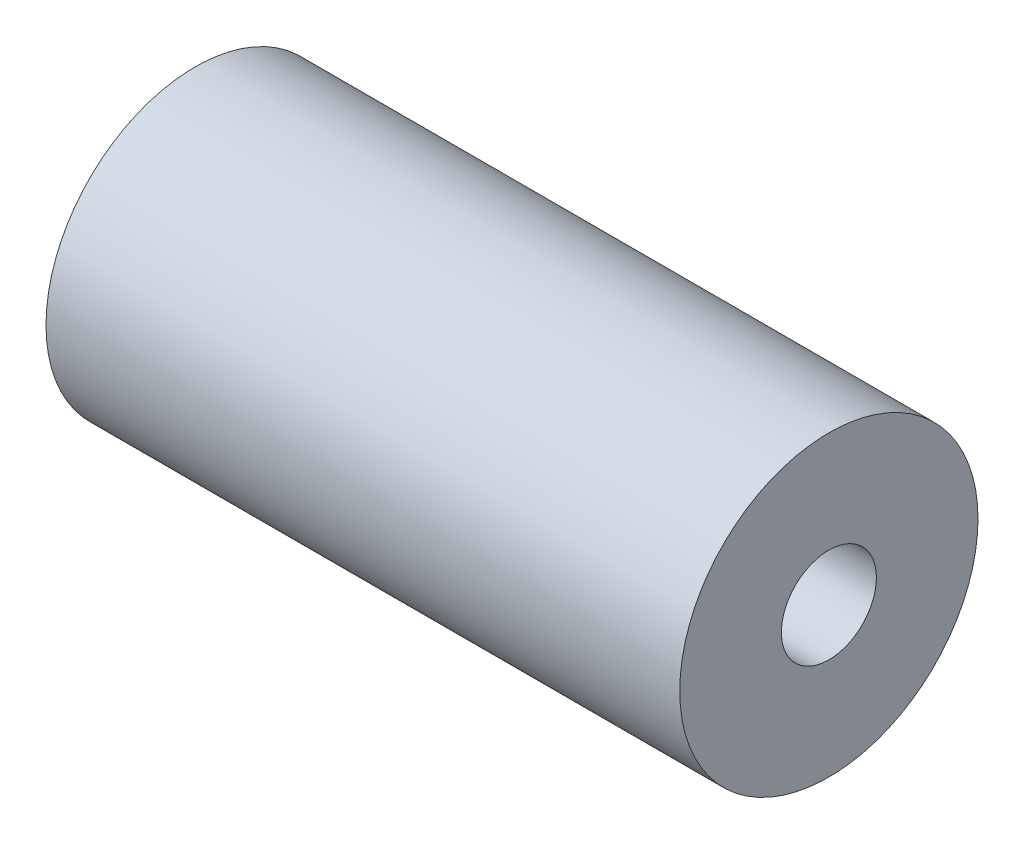
ISO-10303-21;
HEADER;
FILE_DESCRIPTION(('STEP AP214'),'2;1');
FILE_NAME('part.step','',(''),(''),'','','');
FILE_SCHEMA(('AUTOMOTIVE_DESIGN { 1 0 10303 214 1 1 1 1 }'));
ENDSEC;
DATA;
#1=APPLICATION_CONTEXT('core data for automotive mechanical design processes');
#2=APPLICATION_PROTOCOL_DEFINITION('international standard','automotive_design',2000,#1);
#3=PRODUCT_CONTEXT('',#1,'mechanical');
#4=PRODUCT('Part','Part','',(#3));
#5=PRODUCT_RELATED_PRODUCT_CATEGORY('part','',(#4));
#6=PRODUCT_DEFINITION_FORMATION('','',#4);
#7=PRODUCT_DEFINITION_CONTEXT('part definition',#1,'design');
#8=PRODUCT_DEFINITION('design','',#6,#7);
#9=PRODUCT_DEFINITION_SHAPE('','',#8);
#10=(LENGTH_UNIT() NAMED_UNIT(*) SI_UNIT(.MILLI.,.METRE.));
#11=(NAMED_UNIT(*) PLANE_ANGLE_UNIT() SI_UNIT($,.RADIAN.));
#12=(NAMED_UNIT(*) SI_UNIT($,.STERADIAN.) SOLID_ANGLE_UNIT());
#13=UNCERTAINTY_MEASURE_WITH_UNIT(LENGTH_MEASURE(1.E-05),#10,'distance_accuracy_value','');
#14=(GEOMETRIC_REPRESENTATION_CONTEXT(3) GLOBAL_UNCERTAINTY_ASSIGNED_CONTEXT((#13)) GLOBAL_UNIT_ASSIGNED_CONTEXT((#10,
#11,#12)) REPRESENTATION_CONTEXT('',''));
#15=CARTESIAN_POINT('',(0.,0.,0.));
#16=DIRECTION('',(0.,0.,1.));
#17=DIRECTION('',(1.,0.,0.));
#18=AXIS2_PLACEMENT_3D('',#15,#16,#17);
#19=CARTESIAN_POINT('',(34.,0.,0.));
#20=DIRECTION('',(1.,0.,0.));
#21=DIRECTION('',(0.,0.,-1.));
#22=AXIS2_PLACEMENT_3D('',#19,#20,#21);
#23=PLANE('',#22);
#24=CARTESIAN_POINT('',(34.,0.,0.));
#25=DIRECTION('',(1.,0.,0.));
#26=DIRECTION('',(0.,0.,-1.));
#27=AXIS2_PLACEMENT_3D('',#24,#25,#26);
#28=CIRCLE('',#27,8.);
#29=CARTESIAN_POINT('',(34.,0.,-8.));
#30=VERTEX_POINT('',#29);
#31=EDGE_CURVE('E10',#30,#30,#28,.T.);
#32=ORIENTED_EDGE('',*,*,#31,.T.);
#33=EDGE_LOOP('',(#32));
#34=FACE_BOUND('',#33,.T.);
#35=CARTESIAN_POINT('',(34.,0.,0.));
#36=DIRECTION('',(1.,0.,0.));
#37=DIRECTION('',(0.,0.,-1.));
#38=AXIS2_PLACEMENT_3D('',#35,#36,#37);
#39=CIRCLE('',#38,2.55);
#40=CARTESIAN_POINT('',(34.,0.,-2.55));
#41=VERTEX_POINT('',#40);
#42=EDGE_CURVE('E42',#41,#41,#39,.T.);
#43=ORIENTED_EDGE('',*,*,#42,.F.);
#44=EDGE_LOOP('',(#43));
#45=FACE_BOUND('',#44,.T.);
#46=ADVANCED_FACE('F31',(#34,#45),#23,.T.);
#47=CARTESIAN_POINT('',(0.,0.,0.));
#48=DIRECTION('',(1.,0.,0.));
#49=DIRECTION('',(0.,0.,-1.));
#50=AXIS2_PLACEMENT_3D('',#47,#48,#49);
#51=PLANE('',#50);
#52=CARTESIAN_POINT('',(0.,0.,0.));
#53=DIRECTION('',(1.,0.,0.));
#54=DIRECTION('',(0.,0.,-1.));
#55=AXIS2_PLACEMENT_3D('',#52,#53,#54);
#56=CIRCLE('',#55,8.);
#57=CARTESIAN_POINT('',(0.,0.,-8.));
#58=VERTEX_POINT('',#57);
#59=EDGE_CURVE('E35',#58,#58,#56,.T.);
#60=ORIENTED_EDGE('',*,*,#59,.F.);
#61=EDGE_LOOP('',(#60));
#62=FACE_BOUND('',#61,.T.);
#63=CARTESIAN_POINT('',(0.,0.,0.));
#64=DIRECTION('',(1.,0.,0.));
#65=DIRECTION('',(0.,0.,-1.));
#66=AXIS2_PLACEMENT_3D('',#63,#64,#65);
#67=CIRCLE('',#66,2.55);
#68=CARTESIAN_POINT('',(0.,0.,-2.55));
#69=VERTEX_POINT('',#68);
#70=EDGE_CURVE('E44',#69,#69,#67,.T.);
#71=ORIENTED_EDGE('',*,*,#70,.T.);
#72=EDGE_LOOP('',(#71));
#73=FACE_BOUND('',#72,.T.);
#74=ADVANCED_FACE('F54',(#62,#73),#51,.F.);
#75=CARTESIAN_POINT('',(34.,0.,0.));
#76=DIRECTION('',(-1.,0.,0.));
#77=DIRECTION('',(0.,0.,1.));
#78=AXIS2_PLACEMENT_3D('',#75,#76,#77);
#79=CYLINDRICAL_SURFACE('',#78,8.);
#80=ORIENTED_EDGE('',*,*,#31,.F.);
#81=EDGE_LOOP('',(#80));
#82=FACE_BOUND('',#81,.T.);
#83=ORIENTED_EDGE('',*,*,#59,.T.);
#84=EDGE_LOOP('',(#83));
#85=FACE_BOUND('',#84,.T.);
#86=ADVANCED_FACE('F33',(#82,#85),#79,.T.);
#87=CARTESIAN_POINT('',(34.,0.,0.));
#88=DIRECTION('',(-1.,0.,0.));
#89=DIRECTION('',(0.,0.,1.));
#90=AXIS2_PLACEMENT_3D('',#87,#88,#89);
#91=CYLINDRICAL_SURFACE('',#90,2.55);
#92=ORIENTED_EDGE('',*,*,#42,.T.);
#93=EDGE_LOOP('',(#92));
#94=FACE_BOUND('',#93,.T.);
#95=ORIENTED_EDGE('',*,*,#70,.F.);
#96=EDGE_LOOP('',(#95));
#97=FACE_BOUND('',#96,.T.);
#98=ADVANCED_FACE('F50',(#94,#97),#91,.F.);
#99=CLOSED_SHELL('',(#46,#74,#86,#98));
#100=MANIFOLD_SOLID_BREP('B2',#99);
#101=ADVANCED_BREP_SHAPE_REPRESENTATION('',(#18,#100),#14);
#102=SHAPE_DEFINITION_REPRESENTATION(#9,#101);
ENDSEC;
END-ISO-10303-21;
